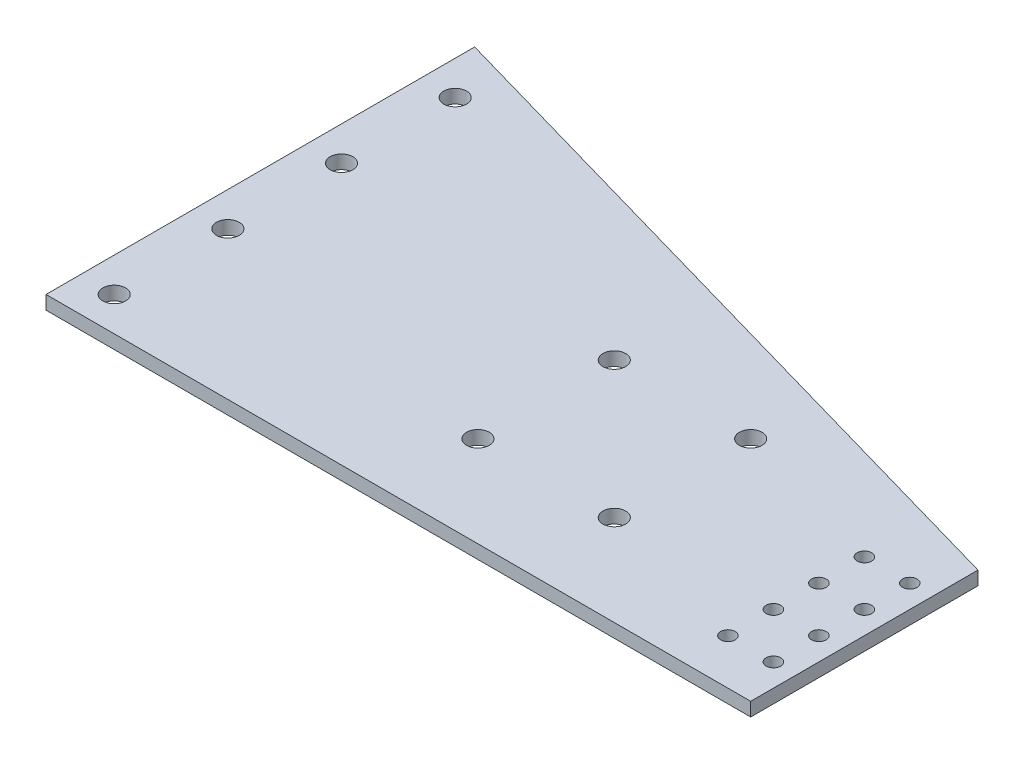
ISO-10303-21;
HEADER;
FILE_DESCRIPTION(('STEP AP214'),'2;1');
FILE_NAME('part.step','',(''),(''),'','','');
FILE_SCHEMA(('AUTOMOTIVE_DESIGN { 1 0 10303 214 1 1 1 1 }'));
ENDSEC;
DATA;
#1=APPLICATION_CONTEXT('core data for automotive mechanical design processes');
#2=APPLICATION_PROTOCOL_DEFINITION('international standard','automotive_design',2000,#1);
#3=PRODUCT_CONTEXT('',#1,'mechanical');
#4=PRODUCT('Part','Part','',(#3));
#5=PRODUCT_RELATED_PRODUCT_CATEGORY('part','',(#4));
#6=PRODUCT_DEFINITION_FORMATION('','',#4);
#7=PRODUCT_DEFINITION_CONTEXT('part definition',#1,'design');
#8=PRODUCT_DEFINITION('design','',#6,#7);
#9=PRODUCT_DEFINITION_SHAPE('','',#8);
#10=(LENGTH_UNIT() NAMED_UNIT(*) SI_UNIT(.MILLI.,.METRE.));
#11=(NAMED_UNIT(*) PLANE_ANGLE_UNIT() SI_UNIT($,.RADIAN.));
#12=(NAMED_UNIT(*) SI_UNIT($,.STERADIAN.) SOLID_ANGLE_UNIT());
#13=UNCERTAINTY_MEASURE_WITH_UNIT(LENGTH_MEASURE(1.E-05),#10,'distance_accuracy_value','');
#14=(GEOMETRIC_REPRESENTATION_CONTEXT(3) GLOBAL_UNCERTAINTY_ASSIGNED_CONTEXT((#13)) GLOBAL_UNIT_ASSIGNED_CONTEXT((#10,
#11,#12)) REPRESENTATION_CONTEXT('',''));
#15=CARTESIAN_POINT('',(0.,0.,0.));
#16=DIRECTION('',(0.,0.,1.));
#17=DIRECTION('',(1.,0.,0.));
#18=AXIS2_PLACEMENT_3D('',#15,#16,#17);
#19=CARTESIAN_POINT('',(0.,0.,0.));
#20=DIRECTION('',(0.,1.,0.));
#21=DIRECTION('',(0.,0.,1.));
#22=AXIS2_PLACEMENT_3D('',#19,#20,#21);
#23=PLANE('',#22);
#24=CARTESIAN_POINT('',(65.,0.,25.));
#25=DIRECTION('',(0.,-1.,0.));
#26=DIRECTION('',(0.,0.,-1.));
#27=AXIS2_PLACEMENT_3D('',#24,#25,#26);
#28=CIRCLE('',#27,1.6);
#29=CARTESIAN_POINT('',(65.,0.,23.4));
#30=VERTEX_POINT('',#29);
#31=EDGE_CURVE('E351',#30,#30,#28,.T.);
#32=ORIENTED_EDGE('',*,*,#31,.F.);
#33=EDGE_LOOP('',(#32));
#34=FACE_BOUND('',#33,.T.);
#35=CARTESIAN_POINT('',(65.,0.,35.));
#36=DIRECTION('',(0.,-1.,0.));
#37=DIRECTION('',(0.,0.,-1.));
#38=AXIS2_PLACEMENT_3D('',#35,#36,#37);
#39=CIRCLE('',#38,1.6);
#40=CARTESIAN_POINT('',(65.,0.,33.4));
#41=VERTEX_POINT('',#40);
#42=EDGE_CURVE('E297',#41,#41,#39,.T.);
#43=ORIENTED_EDGE('',*,*,#42,.F.);
#44=EDGE_LOOP('',(#43));
#45=FACE_BOUND('',#44,.T.);
#46=CARTESIAN_POINT('',(-10.,0.,-5.));
#47=DIRECTION('',(0.,-1.,0.));
#48=DIRECTION('',(0.,0.,-1.));
#49=AXIS2_PLACEMENT_3D('',#46,#47,#48);
#50=CIRCLE('',#49,2.49999999999999);
#51=CARTESIAN_POINT('',(-10.,0.,-7.49999999999999));
#52=VERTEX_POINT('',#51);
#53=EDGE_CURVE('E295',#52,#52,#50,.T.);
#54=ORIENTED_EDGE('',*,*,#53,.F.);
#55=EDGE_LOOP('',(#54));
#56=FACE_BOUND('',#55,.T.);
#57=DIRECTION('',(0.961523947640823,0.,0.274721127897378));
#58=VECTOR('',#57,1.);
#59=CARTESIAN_POINT('',(6.60377358490566,0.,-23.1132075471698));
#60=LINE('',#59,#58);
#61=CARTESIAN_POINT('',(-85.,0.,-49.2857142857143));
#62=VERTEX_POINT('',#61);
#63=CARTESIAN_POINT('',(70.,0.,-5.));
#64=VERTEX_POINT('',#63);
#65=EDGE_CURVE('E105',#62,#64,#60,.T.);
#66=ORIENTED_EDGE('',*,*,#65,.T.);
#67=DIRECTION('',(0.,0.,-1.));
#68=VECTOR('',#67,1.);
#69=CARTESIAN_POINT('',(70.,0.,0.));
#70=LINE('',#69,#68);
#71=CARTESIAN_POINT('',(70.,0.,45.));
#72=VERTEX_POINT('',#71);
#73=EDGE_CURVE('E111',#72,#64,#70,.T.);
#74=ORIENTED_EDGE('',*,*,#73,.F.);
#75=DIRECTION('',(1.,0.,0.));
#76=VECTOR('',#75,1.);
#77=CARTESIAN_POINT('',(0.,0.,45.));
#78=LINE('',#77,#76);
#79=CARTESIAN_POINT('',(-85.,0.,45.));
#80=VERTEX_POINT('',#79);
#81=EDGE_CURVE('E71',#80,#72,#78,.T.);
#82=ORIENTED_EDGE('',*,*,#81,.F.);
#83=DIRECTION('',(0.,0.,1.));
#84=VECTOR('',#83,1.);
#85=CARTESIAN_POINT('',(-85.,0.,0.));
#86=LINE('',#85,#84);
#87=EDGE_CURVE('E97',#62,#80,#86,.T.);
#88=ORIENTED_EDGE('',*,*,#87,.F.);
#89=EDGE_LOOP('',(#66,#74,#82,#88));
#90=FACE_BOUND('',#89,.T.);
#91=CARTESIAN_POINT('',(-77.5,0.,-12.5));
#92=DIRECTION('',(0.,1.,0.));
#93=DIRECTION('',(0.,0.,1.));
#94=AXIS2_PLACEMENT_3D('',#91,#92,#93);
#95=CIRCLE('',#94,2.5);
#96=CARTESIAN_POINT('',(-77.5,0.,-10.));
#97=VERTEX_POINT('',#96);
#98=EDGE_CURVE('E108',#97,#97,#95,.T.);
#99=ORIENTED_EDGE('',*,*,#98,.T.);
#100=EDGE_LOOP('',(#99));
#101=FACE_BOUND('',#100,.T.);
#102=CARTESIAN_POINT('',(-77.5,0.,-37.5));
#103=DIRECTION('',(0.,1.,0.));
#104=DIRECTION('',(0.,0.,1.));
#105=AXIS2_PLACEMENT_3D('',#102,#103,#104);
#106=CIRCLE('',#105,2.5);
#107=CARTESIAN_POINT('',(-77.5,0.,-35.));
#108=VERTEX_POINT('',#107);
#109=EDGE_CURVE('E248',#108,#108,#106,.T.);
#110=ORIENTED_EDGE('',*,*,#109,.T.);
#111=EDGE_LOOP('',(#110));
#112=FACE_BOUND('',#111,.T.);
#113=CARTESIAN_POINT('',(-77.5,0.,12.5));
#114=DIRECTION('',(0.,1.,0.));
#115=DIRECTION('',(0.,0.,1.));
#116=AXIS2_PLACEMENT_3D('',#113,#114,#115);
#117=CIRCLE('',#116,2.5);
#118=CARTESIAN_POINT('',(-77.5,0.,15.));
#119=VERTEX_POINT('',#118);
#120=EDGE_CURVE('E265',#119,#119,#117,.T.);
#121=ORIENTED_EDGE('',*,*,#120,.T.);
#122=EDGE_LOOP('',(#121));
#123=FACE_BOUND('',#122,.T.);
#124=CARTESIAN_POINT('',(-77.5,0.,37.5));
#125=DIRECTION('',(0.,1.,0.));
#126=DIRECTION('',(0.,0.,1.));
#127=AXIS2_PLACEMENT_3D('',#124,#125,#126);
#128=CIRCLE('',#127,2.5);
#129=CARTESIAN_POINT('',(-77.5,0.,40.));
#130=VERTEX_POINT('',#129);
#131=EDGE_CURVE('E269',#130,#130,#128,.T.);
#132=ORIENTED_EDGE('',*,*,#131,.T.);
#133=EDGE_LOOP('',(#132));
#134=FACE_BOUND('',#133,.T.);
#135=CARTESIAN_POINT('',(20.,0.,25.));
#136=DIRECTION('',(0.,-1.,0.));
#137=DIRECTION('',(0.,0.,-1.));
#138=AXIS2_PLACEMENT_3D('',#135,#136,#137);
#139=CIRCLE('',#138,2.49999999999999);
#140=CARTESIAN_POINT('',(20.,0.,22.5));
#141=VERTEX_POINT('',#140);
#142=EDGE_CURVE('E273',#141,#141,#139,.T.);
#143=ORIENTED_EDGE('',*,*,#142,.F.);
#144=EDGE_LOOP('',(#143));
#145=FACE_BOUND('',#144,.T.);
#146=CARTESIAN_POINT('',(20.,0.,-4.99999999999999));
#147=DIRECTION('',(0.,-1.,0.));
#148=DIRECTION('',(0.,0.,-1.));
#149=AXIS2_PLACEMENT_3D('',#146,#147,#148);
#150=CIRCLE('',#149,2.49999999999999);
#151=CARTESIAN_POINT('',(20.,0.,-7.49999999999998));
#152=VERTEX_POINT('',#151);
#153=EDGE_CURVE('E277',#152,#152,#150,.T.);
#154=ORIENTED_EDGE('',*,*,#153,.F.);
#155=EDGE_LOOP('',(#154));
#156=FACE_BOUND('',#155,.T.);
#157=CARTESIAN_POINT('',(-10.,0.,25.));
#158=DIRECTION('',(0.,-1.,0.));
#159=DIRECTION('',(0.,0.,-1.));
#160=AXIS2_PLACEMENT_3D('',#157,#158,#159);
#161=CIRCLE('',#160,2.49999999999999);
#162=CARTESIAN_POINT('',(-10.,0.,22.5));
#163=VERTEX_POINT('',#162);
#164=EDGE_CURVE('E281',#163,#163,#161,.T.);
#165=ORIENTED_EDGE('',*,*,#164,.F.);
#166=EDGE_LOOP('',(#165));
#167=FACE_BOUND('',#166,.T.);
#168=CARTESIAN_POINT('',(65.,0.,15.));
#169=DIRECTION('',(0.,-1.,0.));
#170=DIRECTION('',(0.,0.,-1.));
#171=AXIS2_PLACEMENT_3D('',#168,#169,#170);
#172=CIRCLE('',#171,1.6);
#173=CARTESIAN_POINT('',(65.,0.,13.4));
#174=VERTEX_POINT('',#173);
#175=EDGE_CURVE('E119',#174,#174,#172,.T.);
#176=ORIENTED_EDGE('',*,*,#175,.F.);
#177=EDGE_LOOP('',(#176));
#178=FACE_BOUND('',#177,.T.);
#179=CARTESIAN_POINT('',(65.,0.,5.));
#180=DIRECTION('',(0.,-1.,0.));
#181=DIRECTION('',(0.,0.,-1.));
#182=AXIS2_PLACEMENT_3D('',#179,#180,#181);
#183=CIRCLE('',#182,1.6);
#184=CARTESIAN_POINT('',(65.,0.,3.39999999999999));
#185=VERTEX_POINT('',#184);
#186=EDGE_CURVE('E125',#185,#185,#183,.T.);
#187=ORIENTED_EDGE('',*,*,#186,.F.);
#188=EDGE_LOOP('',(#187));
#189=FACE_BOUND('',#188,.T.);
#190=CARTESIAN_POINT('',(55.,0.,35.));
#191=DIRECTION('',(0.,-1.,0.));
#192=DIRECTION('',(0.,0.,-1.));
#193=AXIS2_PLACEMENT_3D('',#190,#191,#192);
#194=CIRCLE('',#193,1.6);
#195=CARTESIAN_POINT('',(55.,0.,33.4));
#196=VERTEX_POINT('',#195);
#197=EDGE_CURVE('E131',#196,#196,#194,.T.);
#198=ORIENTED_EDGE('',*,*,#197,.F.);
#199=EDGE_LOOP('',(#198));
#200=FACE_BOUND('',#199,.T.);
#201=CARTESIAN_POINT('',(55.,0.,25.));
#202=DIRECTION('',(0.,-1.,0.));
#203=DIRECTION('',(0.,0.,-1.));
#204=AXIS2_PLACEMENT_3D('',#201,#202,#203);
#205=CIRCLE('',#204,1.6);
#206=CARTESIAN_POINT('',(55.,0.,23.4));
#207=VERTEX_POINT('',#206);
#208=EDGE_CURVE('E137',#207,#207,#205,.T.);
#209=ORIENTED_EDGE('',*,*,#208,.F.);
#210=EDGE_LOOP('',(#209));
#211=FACE_BOUND('',#210,.T.);
#212=CARTESIAN_POINT('',(55.,0.,15.));
#213=DIRECTION('',(0.,-1.,0.));
#214=DIRECTION('',(0.,0.,-1.));
#215=AXIS2_PLACEMENT_3D('',#212,#213,#214);
#216=CIRCLE('',#215,1.6);
#217=CARTESIAN_POINT('',(55.,0.,13.4));
#218=VERTEX_POINT('',#217);
#219=EDGE_CURVE('E143',#218,#218,#216,.T.);
#220=ORIENTED_EDGE('',*,*,#219,.F.);
#221=EDGE_LOOP('',(#220));
#222=FACE_BOUND('',#221,.T.);
#223=CARTESIAN_POINT('',(55.,0.,5.));
#224=DIRECTION('',(0.,-1.,0.));
#225=DIRECTION('',(0.,0.,-1.));
#226=AXIS2_PLACEMENT_3D('',#223,#224,#225);
#227=CIRCLE('',#226,1.6);
#228=CARTESIAN_POINT('',(55.,0.,3.39999999999999));
#229=VERTEX_POINT('',#228);
#230=EDGE_CURVE('E11',#229,#229,#227,.T.);
#231=ORIENTED_EDGE('',*,*,#230,.F.);
#232=EDGE_LOOP('',(#231));
#233=FACE_BOUND('',#232,.T.);
#234=ADVANCED_FACE('F37',(#34,#45,#56,#90,#101,#112,#123,#134,#145,#156,#167,#178,#189,#200,
#211,#222,#233),#23,.F.);
#235=CARTESIAN_POINT('',(6.60377358490566,3.,-23.1132075471698));
#236=DIRECTION('',(0.274721127897378,0.,-0.961523947640823));
#237=DIRECTION('',(-0.961523947640823,0.,-0.274721127897378));
#238=AXIS2_PLACEMENT_3D('',#235,#236,#237);
#239=PLANE('',#238);
#240=ORIENTED_EDGE('',*,*,#65,.F.);
#241=DIRECTION('',(0.,-1.,0.));
#242=VECTOR('',#241,1.);
#243=CARTESIAN_POINT('',(-85.,3.,-49.2857142857143));
#244=LINE('',#243,#242);
#245=CARTESIAN_POINT('',(-85.,3.,-49.2857142857143));
#246=VERTEX_POINT('',#245);
#247=EDGE_CURVE('E82',#246,#62,#244,.T.);
#248=ORIENTED_EDGE('',*,*,#247,.F.);
#249=DIRECTION('',(0.961523947640823,0.,0.274721127897378));
#250=VECTOR('',#249,1.);
#251=CARTESIAN_POINT('',(6.60377358490566,3.,-23.1132075471698));
#252=LINE('',#251,#250);
#253=CARTESIAN_POINT('',(70.,3.,-5.));
#254=VERTEX_POINT('',#253);
#255=EDGE_CURVE('E91',#246,#254,#252,.T.);
#256=ORIENTED_EDGE('',*,*,#255,.T.);
#257=DIRECTION('',(0.,-1.,0.));
#258=VECTOR('',#257,1.);
#259=CARTESIAN_POINT('',(70.,3.,-5.));
#260=LINE('',#259,#258);
#261=EDGE_CURVE('E78',#254,#64,#260,.T.);
#262=ORIENTED_EDGE('',*,*,#261,.T.);
#263=EDGE_LOOP('',(#240,#248,#256,#262));
#264=FACE_BOUND('',#263,.T.);
#265=ADVANCED_FACE('F155',(#264),#239,.T.);
#266=CARTESIAN_POINT('',(-85.,3.,0.));
#267=DIRECTION('',(1.,0.,0.));
#268=DIRECTION('',(0.,0.,-1.));
#269=AXIS2_PLACEMENT_3D('',#266,#267,#268);
#270=PLANE('',#269);
#271=ORIENTED_EDGE('',*,*,#87,.T.);
#272=DIRECTION('',(0.,-1.,0.));
#273=VECTOR('',#272,1.);
#274=CARTESIAN_POINT('',(-85.,3.,45.));
#275=LINE('',#274,#273);
#276=CARTESIAN_POINT('',(-85.,3.,45.));
#277=VERTEX_POINT('',#276);
#278=EDGE_CURVE('E94',#277,#80,#275,.T.);
#279=ORIENTED_EDGE('',*,*,#278,.F.);
#280=DIRECTION('',(0.,0.,1.));
#281=VECTOR('',#280,1.);
#282=CARTESIAN_POINT('',(-85.,3.,0.));
#283=LINE('',#282,#281);
#284=EDGE_CURVE('E85',#246,#277,#283,.T.);
#285=ORIENTED_EDGE('',*,*,#284,.F.);
#286=ORIENTED_EDGE('',*,*,#247,.T.);
#287=EDGE_LOOP('',(#271,#279,#285,#286));
#288=FACE_BOUND('',#287,.T.);
#289=ADVANCED_FACE('F95',(#288),#270,.F.);
#290=CARTESIAN_POINT('',(0.,3.,45.));
#291=DIRECTION('',(0.,0.,-1.));
#292=DIRECTION('',(-1.,0.,0.));
#293=AXIS2_PLACEMENT_3D('',#290,#291,#292);
#294=PLANE('',#293);
#295=ORIENTED_EDGE('',*,*,#81,.T.);
#296=DIRECTION('',(0.,-1.,0.));
#297=VECTOR('',#296,1.);
#298=CARTESIAN_POINT('',(70.,3.,45.));
#299=LINE('',#298,#297);
#300=CARTESIAN_POINT('',(70.,3.,45.));
#301=VERTEX_POINT('',#300);
#302=EDGE_CURVE('E98',#301,#72,#299,.T.);
#303=ORIENTED_EDGE('',*,*,#302,.F.);
#304=DIRECTION('',(1.,0.,0.));
#305=VECTOR('',#304,1.);
#306=CARTESIAN_POINT('',(0.,3.,45.));
#307=LINE('',#306,#305);
#308=EDGE_CURVE('E90',#277,#301,#307,.T.);
#309=ORIENTED_EDGE('',*,*,#308,.F.);
#310=ORIENTED_EDGE('',*,*,#278,.T.);
#311=EDGE_LOOP('',(#295,#303,#309,#310));
#312=FACE_BOUND('',#311,.T.);
#313=ADVANCED_FACE('F100',(#312),#294,.F.);
#314=CARTESIAN_POINT('',(70.,3.,0.));
#315=DIRECTION('',(-1.,0.,0.));
#316=DIRECTION('',(0.,0.,1.));
#317=AXIS2_PLACEMENT_3D('',#314,#315,#316);
#318=PLANE('',#317);
#319=ORIENTED_EDGE('',*,*,#73,.T.);
#320=ORIENTED_EDGE('',*,*,#261,.F.);
#321=DIRECTION('',(0.,0.,-1.));
#322=VECTOR('',#321,1.);
#323=CARTESIAN_POINT('',(70.,3.,0.));
#324=LINE('',#323,#322);
#325=EDGE_CURVE('E54',#301,#254,#324,.T.);
#326=ORIENTED_EDGE('',*,*,#325,.F.);
#327=ORIENTED_EDGE('',*,*,#302,.T.);
#328=EDGE_LOOP('',(#319,#320,#326,#327));
#329=FACE_BOUND('',#328,.T.);
#330=ADVANCED_FACE('F167',(#329),#318,.F.);
#331=CARTESIAN_POINT('',(0.,3.,0.));
#332=DIRECTION('',(0.,1.,0.));
#333=DIRECTION('',(0.,0.,1.));
#334=AXIS2_PLACEMENT_3D('',#331,#332,#333);
#335=PLANE('',#334);
#336=CARTESIAN_POINT('',(65.,3.,25.));
#337=DIRECTION('',(0.,-1.,0.));
#338=DIRECTION('',(0.,0.,-1.));
#339=AXIS2_PLACEMENT_3D('',#336,#337,#338);
#340=CIRCLE('',#339,1.6);
#341=CARTESIAN_POINT('',(65.,3.,23.4));
#342=VERTEX_POINT('',#341);
#343=EDGE_CURVE('E211',#342,#342,#340,.T.);
#344=ORIENTED_EDGE('',*,*,#343,.T.);
#345=EDGE_LOOP('',(#344));
#346=FACE_BOUND('',#345,.T.);
#347=CARTESIAN_POINT('',(65.,3.,35.));
#348=DIRECTION('',(0.,-1.,0.));
#349=DIRECTION('',(0.,0.,-1.));
#350=AXIS2_PLACEMENT_3D('',#347,#348,#349);
#351=CIRCLE('',#350,1.6);
#352=CARTESIAN_POINT('',(65.,3.,33.4));
#353=VERTEX_POINT('',#352);
#354=EDGE_CURVE('E215',#353,#353,#351,.T.);
#355=ORIENTED_EDGE('',*,*,#354,.T.);
#356=EDGE_LOOP('',(#355));
#357=FACE_BOUND('',#356,.T.);
#358=CARTESIAN_POINT('',(-10.,3.,25.));
#359=DIRECTION('',(0.,1.,0.));
#360=DIRECTION('',(0.,0.,1.));
#361=AXIS2_PLACEMENT_3D('',#358,#359,#360);
#362=CIRCLE('',#361,2.49999999999999);
#363=CARTESIAN_POINT('',(-10.,3.,27.5));
#364=VERTEX_POINT('',#363);
#365=EDGE_CURVE('E219',#364,#364,#362,.T.);
#366=ORIENTED_EDGE('',*,*,#365,.F.);
#367=EDGE_LOOP('',(#366));
#368=FACE_BOUND('',#367,.T.);
#369=CARTESIAN_POINT('',(-10.,3.,-5.));
#370=DIRECTION('',(0.,1.,0.));
#371=DIRECTION('',(0.,0.,1.));
#372=AXIS2_PLACEMENT_3D('',#369,#370,#371);
#373=CIRCLE('',#372,2.49999999999999);
#374=CARTESIAN_POINT('',(-10.,3.,-2.5));
#375=VERTEX_POINT('',#374);
#376=EDGE_CURVE('E223',#375,#375,#373,.T.);
#377=ORIENTED_EDGE('',*,*,#376,.F.);
#378=EDGE_LOOP('',(#377));
#379=FACE_BOUND('',#378,.T.);
#380=CARTESIAN_POINT('',(20.,3.,-4.99999999999999));
#381=DIRECTION('',(0.,1.,0.));
#382=DIRECTION('',(0.,0.,1.));
#383=AXIS2_PLACEMENT_3D('',#380,#381,#382);
#384=CIRCLE('',#383,2.49999999999999);
#385=CARTESIAN_POINT('',(20.,3.,-2.5));
#386=VERTEX_POINT('',#385);
#387=EDGE_CURVE('E227',#386,#386,#384,.T.);
#388=ORIENTED_EDGE('',*,*,#387,.F.);
#389=EDGE_LOOP('',(#388));
#390=FACE_BOUND('',#389,.T.);
#391=CARTESIAN_POINT('',(20.,3.,25.));
#392=DIRECTION('',(0.,1.,0.));
#393=DIRECTION('',(0.,0.,1.));
#394=AXIS2_PLACEMENT_3D('',#391,#392,#393);
#395=CIRCLE('',#394,2.49999999999999);
#396=CARTESIAN_POINT('',(20.,3.,27.5));
#397=VERTEX_POINT('',#396);
#398=EDGE_CURVE('E231',#397,#397,#395,.T.);
#399=ORIENTED_EDGE('',*,*,#398,.F.);
#400=EDGE_LOOP('',(#399));
#401=FACE_BOUND('',#400,.T.);
#402=CARTESIAN_POINT('',(-77.5,3.,37.5));
#403=DIRECTION('',(0.,1.,0.));
#404=DIRECTION('',(0.,0.,1.));
#405=AXIS2_PLACEMENT_3D('',#402,#403,#404);
#406=CIRCLE('',#405,2.5);
#407=CARTESIAN_POINT('',(-77.5,3.,40.));
#408=VERTEX_POINT('',#407);
#409=EDGE_CURVE('E235',#408,#408,#406,.T.);
#410=ORIENTED_EDGE('',*,*,#409,.F.);
#411=EDGE_LOOP('',(#410));
#412=FACE_BOUND('',#411,.T.);
#413=CARTESIAN_POINT('',(-77.5,3.,12.5));
#414=DIRECTION('',(0.,1.,0.));
#415=DIRECTION('',(0.,0.,1.));
#416=AXIS2_PLACEMENT_3D('',#413,#414,#415);
#417=CIRCLE('',#416,2.5);
#418=CARTESIAN_POINT('',(-77.5,3.,15.));
#419=VERTEX_POINT('',#418);
#420=EDGE_CURVE('E239',#419,#419,#417,.T.);
#421=ORIENTED_EDGE('',*,*,#420,.F.);
#422=EDGE_LOOP('',(#421));
#423=FACE_BOUND('',#422,.T.);
#424=CARTESIAN_POINT('',(-77.5,3.,-37.5));
#425=DIRECTION('',(0.,1.,0.));
#426=DIRECTION('',(0.,0.,1.));
#427=AXIS2_PLACEMENT_3D('',#424,#425,#426);
#428=CIRCLE('',#427,2.5);
#429=CARTESIAN_POINT('',(-77.5,3.,-35.));
#430=VERTEX_POINT('',#429);
#431=EDGE_CURVE('E243',#430,#430,#428,.T.);
#432=ORIENTED_EDGE('',*,*,#431,.F.);
#433=EDGE_LOOP('',(#432));
#434=FACE_BOUND('',#433,.T.);
#435=CARTESIAN_POINT('',(-77.5,3.,-12.5));
#436=DIRECTION('',(0.,1.,0.));
#437=DIRECTION('',(0.,0.,1.));
#438=AXIS2_PLACEMENT_3D('',#435,#436,#437);
#439=CIRCLE('',#438,2.5);
#440=CARTESIAN_POINT('',(-77.5,3.,-10.));
#441=VERTEX_POINT('',#440);
#442=EDGE_CURVE('E246',#441,#441,#439,.T.);
#443=ORIENTED_EDGE('',*,*,#442,.F.);
#444=EDGE_LOOP('',(#443));
#445=FACE_BOUND('',#444,.T.);
#446=ORIENTED_EDGE('',*,*,#255,.F.);
#447=ORIENTED_EDGE('',*,*,#284,.T.);
#448=ORIENTED_EDGE('',*,*,#308,.T.);
#449=ORIENTED_EDGE('',*,*,#325,.T.);
#450=EDGE_LOOP('',(#446,#447,#448,#449));
#451=FACE_BOUND('',#450,.T.);
#452=CARTESIAN_POINT('',(65.,3.,15.));
#453=DIRECTION('',(0.,-1.,0.));
#454=DIRECTION('',(0.,0.,-1.));
#455=AXIS2_PLACEMENT_3D('',#452,#453,#454);
#456=CIRCLE('',#455,1.6);
#457=CARTESIAN_POINT('',(65.,3.,13.4));
#458=VERTEX_POINT('',#457);
#459=EDGE_CURVE('E116',#458,#458,#456,.T.);
#460=ORIENTED_EDGE('',*,*,#459,.T.);
#461=EDGE_LOOP('',(#460));
#462=FACE_BOUND('',#461,.T.);
#463=CARTESIAN_POINT('',(65.,3.,5.));
#464=DIRECTION('',(0.,-1.,0.));
#465=DIRECTION('',(0.,0.,-1.));
#466=AXIS2_PLACEMENT_3D('',#463,#464,#465);
#467=CIRCLE('',#466,1.6);
#468=CARTESIAN_POINT('',(65.,3.,3.39999999999999));
#469=VERTEX_POINT('',#468);
#470=EDGE_CURVE('E122',#469,#469,#467,.T.);
#471=ORIENTED_EDGE('',*,*,#470,.T.);
#472=EDGE_LOOP('',(#471));
#473=FACE_BOUND('',#472,.T.);
#474=CARTESIAN_POINT('',(55.,3.,35.));
#475=DIRECTION('',(0.,-1.,0.));
#476=DIRECTION('',(0.,0.,-1.));
#477=AXIS2_PLACEMENT_3D('',#474,#475,#476);
#478=CIRCLE('',#477,1.6);
#479=CARTESIAN_POINT('',(55.,3.,33.4));
#480=VERTEX_POINT('',#479);
#481=EDGE_CURVE('E128',#480,#480,#478,.T.);
#482=ORIENTED_EDGE('',*,*,#481,.T.);
#483=EDGE_LOOP('',(#482));
#484=FACE_BOUND('',#483,.T.);
#485=CARTESIAN_POINT('',(55.,3.,25.));
#486=DIRECTION('',(0.,-1.,0.));
#487=DIRECTION('',(0.,0.,-1.));
#488=AXIS2_PLACEMENT_3D('',#485,#486,#487);
#489=CIRCLE('',#488,1.6);
#490=CARTESIAN_POINT('',(55.,3.,23.4));
#491=VERTEX_POINT('',#490);
#492=EDGE_CURVE('E134',#491,#491,#489,.T.);
#493=ORIENTED_EDGE('',*,*,#492,.T.);
#494=EDGE_LOOP('',(#493));
#495=FACE_BOUND('',#494,.T.);
#496=CARTESIAN_POINT('',(55.,3.,15.));
#497=DIRECTION('',(0.,-1.,0.));
#498=DIRECTION('',(0.,0.,-1.));
#499=AXIS2_PLACEMENT_3D('',#496,#497,#498);
#500=CIRCLE('',#499,1.6);
#501=CARTESIAN_POINT('',(55.,3.,13.4));
#502=VERTEX_POINT('',#501);
#503=EDGE_CURVE('E140',#502,#502,#500,.T.);
#504=ORIENTED_EDGE('',*,*,#503,.T.);
#505=EDGE_LOOP('',(#504));
#506=FACE_BOUND('',#505,.T.);
#507=CARTESIAN_POINT('',(55.,3.,5.));
#508=DIRECTION('',(0.,-1.,0.));
#509=DIRECTION('',(0.,0.,-1.));
#510=AXIS2_PLACEMENT_3D('',#507,#508,#509);
#511=CIRCLE('',#510,1.6);
#512=CARTESIAN_POINT('',(55.,3.,3.39999999999999));
#513=VERTEX_POINT('',#512);
#514=EDGE_CURVE('E46',#513,#513,#511,.T.);
#515=ORIENTED_EDGE('',*,*,#514,.T.);
#516=EDGE_LOOP('',(#515));
#517=FACE_BOUND('',#516,.T.);
#518=ADVANCED_FACE('F87',(#346,#357,#368,#379,#390,#401,#412,#423,#434,#445,#451,#462,#473,#484,
#495,#506,#517),#335,.T.);
#519=CARTESIAN_POINT('',(-77.5,3.,-12.5));
#520=DIRECTION('',(0.,1.,0.));
#521=DIRECTION('',(0.,0.,1.));
#522=AXIS2_PLACEMENT_3D('',#519,#520,#521);
#523=CYLINDRICAL_SURFACE('',#522,2.5);
#524=ORIENTED_EDGE('',*,*,#98,.F.);
#525=EDGE_LOOP('',(#524));
#526=FACE_BOUND('',#525,.T.);
#527=ORIENTED_EDGE('',*,*,#442,.T.);
#528=EDGE_LOOP('',(#527));
#529=FACE_BOUND('',#528,.T.);
#530=ADVANCED_FACE('F201',(#526,#529),#523,.F.);
#531=CARTESIAN_POINT('',(-77.5,3.,-37.5));
#532=DIRECTION('',(0.,1.,0.));
#533=DIRECTION('',(0.,0.,1.));
#534=AXIS2_PLACEMENT_3D('',#531,#532,#533);
#535=CYLINDRICAL_SURFACE('',#534,2.5);
#536=ORIENTED_EDGE('',*,*,#109,.F.);
#537=EDGE_LOOP('',(#536));
#538=FACE_BOUND('',#537,.T.);
#539=ORIENTED_EDGE('',*,*,#431,.T.);
#540=EDGE_LOOP('',(#539));
#541=FACE_BOUND('',#540,.T.);
#542=ADVANCED_FACE('F206',(#538,#541),#535,.F.);
#543=CARTESIAN_POINT('',(-77.5,3.,12.5));
#544=DIRECTION('',(0.,1.,0.));
#545=DIRECTION('',(0.,0.,1.));
#546=AXIS2_PLACEMENT_3D('',#543,#544,#545);
#547=CYLINDRICAL_SURFACE('',#546,2.5);
#548=ORIENTED_EDGE('',*,*,#120,.F.);
#549=EDGE_LOOP('',(#548));
#550=FACE_BOUND('',#549,.T.);
#551=ORIENTED_EDGE('',*,*,#420,.T.);
#552=EDGE_LOOP('',(#551));
#553=FACE_BOUND('',#552,.T.);
#554=ADVANCED_FACE('F313',(#550,#553),#547,.F.);
#555=CARTESIAN_POINT('',(-77.5,3.,37.5));
#556=DIRECTION('',(0.,1.,0.));
#557=DIRECTION('',(0.,0.,1.));
#558=AXIS2_PLACEMENT_3D('',#555,#556,#557);
#559=CYLINDRICAL_SURFACE('',#558,2.5);
#560=ORIENTED_EDGE('',*,*,#131,.F.);
#561=EDGE_LOOP('',(#560));
#562=FACE_BOUND('',#561,.T.);
#563=ORIENTED_EDGE('',*,*,#409,.T.);
#564=EDGE_LOOP('',(#563));
#565=FACE_BOUND('',#564,.T.);
#566=ADVANCED_FACE('F319',(#562,#565),#559,.F.);
#567=CARTESIAN_POINT('',(20.,0.,25.));
#568=DIRECTION('',(0.,-1.,0.));
#569=DIRECTION('',(0.,0.,-1.));
#570=AXIS2_PLACEMENT_3D('',#567,#568,#569);
#571=CYLINDRICAL_SURFACE('',#570,2.49999999999999);
#572=ORIENTED_EDGE('',*,*,#142,.T.);
#573=EDGE_LOOP('',(#572));
#574=FACE_BOUND('',#573,.T.);
#575=ORIENTED_EDGE('',*,*,#398,.T.);
#576=EDGE_LOOP('',(#575));
#577=FACE_BOUND('',#576,.T.);
#578=ADVANCED_FACE('F325',(#574,#577),#571,.F.);
#579=CARTESIAN_POINT('',(20.,0.,-4.99999999999999));
#580=DIRECTION('',(0.,-1.,0.));
#581=DIRECTION('',(0.,0.,-1.));
#582=AXIS2_PLACEMENT_3D('',#579,#580,#581);
#583=CYLINDRICAL_SURFACE('',#582,2.49999999999999);
#584=ORIENTED_EDGE('',*,*,#153,.T.);
#585=EDGE_LOOP('',(#584));
#586=FACE_BOUND('',#585,.T.);
#587=ORIENTED_EDGE('',*,*,#387,.T.);
#588=EDGE_LOOP('',(#587));
#589=FACE_BOUND('',#588,.T.);
#590=ADVANCED_FACE('F329',(#586,#589),#583,.F.);
#591=CARTESIAN_POINT('',(-10.,0.,-5.));
#592=DIRECTION('',(0.,-1.,0.));
#593=DIRECTION('',(0.,0.,-1.));
#594=AXIS2_PLACEMENT_3D('',#591,#592,#593);
#595=CYLINDRICAL_SURFACE('',#594,2.49999999999999);
#596=ORIENTED_EDGE('',*,*,#53,.T.);
#597=EDGE_LOOP('',(#596));
#598=FACE_BOUND('',#597,.T.);
#599=ORIENTED_EDGE('',*,*,#376,.T.);
#600=EDGE_LOOP('',(#599));
#601=FACE_BOUND('',#600,.T.);
#602=ADVANCED_FACE('F333',(#598,#601),#595,.F.);
#603=CARTESIAN_POINT('',(-10.,0.,25.));
#604=DIRECTION('',(0.,-1.,0.));
#605=DIRECTION('',(0.,0.,-1.));
#606=AXIS2_PLACEMENT_3D('',#603,#604,#605);
#607=CYLINDRICAL_SURFACE('',#606,2.49999999999999);
#608=ORIENTED_EDGE('',*,*,#164,.T.);
#609=EDGE_LOOP('',(#608));
#610=FACE_BOUND('',#609,.T.);
#611=ORIENTED_EDGE('',*,*,#365,.T.);
#612=EDGE_LOOP('',(#611));
#613=FACE_BOUND('',#612,.T.);
#614=ADVANCED_FACE('F337',(#610,#613),#607,.F.);
#615=CARTESIAN_POINT('',(65.,0.,35.));
#616=DIRECTION('',(0.,-1.,0.));
#617=DIRECTION('',(0.,0.,-1.));
#618=AXIS2_PLACEMENT_3D('',#615,#616,#617);
#619=CYLINDRICAL_SURFACE('',#618,1.6);
#620=ORIENTED_EDGE('',*,*,#354,.F.);
#621=EDGE_LOOP('',(#620));
#622=FACE_BOUND('',#621,.T.);
#623=ORIENTED_EDGE('',*,*,#42,.T.);
#624=EDGE_LOOP('',(#623));
#625=FACE_BOUND('',#624,.T.);
#626=ADVANCED_FACE('F341',(#622,#625),#619,.F.);
#627=CARTESIAN_POINT('',(65.,0.,25.));
#628=DIRECTION('',(0.,-1.,0.));
#629=DIRECTION('',(0.,0.,-1.));
#630=AXIS2_PLACEMENT_3D('',#627,#628,#629);
#631=CYLINDRICAL_SURFACE('',#630,1.6);
#632=ORIENTED_EDGE('',*,*,#343,.F.);
#633=EDGE_LOOP('',(#632));
#634=FACE_BOUND('',#633,.T.);
#635=ORIENTED_EDGE('',*,*,#31,.T.);
#636=EDGE_LOOP('',(#635));
#637=FACE_BOUND('',#636,.T.);
#638=ADVANCED_FACE('F179',(#634,#637),#631,.F.);
#639=CARTESIAN_POINT('',(65.,0.,15.));
#640=DIRECTION('',(0.,-1.,0.));
#641=DIRECTION('',(0.,0.,-1.));
#642=AXIS2_PLACEMENT_3D('',#639,#640,#641);
#643=CYLINDRICAL_SURFACE('',#642,1.6);
#644=ORIENTED_EDGE('',*,*,#459,.F.);
#645=EDGE_LOOP('',(#644));
#646=FACE_BOUND('',#645,.T.);
#647=ORIENTED_EDGE('',*,*,#175,.T.);
#648=EDGE_LOOP('',(#647));
#649=FACE_BOUND('',#648,.T.);
#650=ADVANCED_FACE('F175',(#646,#649),#643,.F.);
#651=CARTESIAN_POINT('',(65.,0.,5.));
#652=DIRECTION('',(0.,-1.,0.));
#653=DIRECTION('',(0.,0.,-1.));
#654=AXIS2_PLACEMENT_3D('',#651,#652,#653);
#655=CYLINDRICAL_SURFACE('',#654,1.6);
#656=ORIENTED_EDGE('',*,*,#470,.F.);
#657=EDGE_LOOP('',(#656));
#658=FACE_BOUND('',#657,.T.);
#659=ORIENTED_EDGE('',*,*,#186,.T.);
#660=EDGE_LOOP('',(#659));
#661=FACE_BOUND('',#660,.T.);
#662=ADVANCED_FACE('F178',(#658,#661),#655,.F.);
#663=CARTESIAN_POINT('',(55.,0.,35.));
#664=DIRECTION('',(0.,-1.,0.));
#665=DIRECTION('',(0.,0.,-1.));
#666=AXIS2_PLACEMENT_3D('',#663,#664,#665);
#667=CYLINDRICAL_SURFACE('',#666,1.6);
#668=ORIENTED_EDGE('',*,*,#481,.F.);
#669=EDGE_LOOP('',(#668));
#670=FACE_BOUND('',#669,.T.);
#671=ORIENTED_EDGE('',*,*,#197,.T.);
#672=EDGE_LOOP('',(#671));
#673=FACE_BOUND('',#672,.T.);
#674=ADVANCED_FACE('F183',(#670,#673),#667,.F.);
#675=CARTESIAN_POINT('',(55.,0.,25.));
#676=DIRECTION('',(0.,-1.,0.));
#677=DIRECTION('',(0.,0.,-1.));
#678=AXIS2_PLACEMENT_3D('',#675,#676,#677);
#679=CYLINDRICAL_SURFACE('',#678,1.6);
#680=ORIENTED_EDGE('',*,*,#492,.F.);
#681=EDGE_LOOP('',(#680));
#682=FACE_BOUND('',#681,.T.);
#683=ORIENTED_EDGE('',*,*,#208,.T.);
#684=EDGE_LOOP('',(#683));
#685=FACE_BOUND('',#684,.T.);
#686=ADVANCED_FACE('F187',(#682,#685),#679,.F.);
#687=CARTESIAN_POINT('',(55.,0.,15.));
#688=DIRECTION('',(0.,-1.,0.));
#689=DIRECTION('',(0.,0.,-1.));
#690=AXIS2_PLACEMENT_3D('',#687,#688,#689);
#691=CYLINDRICAL_SURFACE('',#690,1.6);
#692=ORIENTED_EDGE('',*,*,#503,.F.);
#693=EDGE_LOOP('',(#692));
#694=FACE_BOUND('',#693,.T.);
#695=ORIENTED_EDGE('',*,*,#219,.T.);
#696=EDGE_LOOP('',(#695));
#697=FACE_BOUND('',#696,.T.);
#698=ADVANCED_FACE('F151',(#694,#697),#691,.F.);
#699=CARTESIAN_POINT('',(55.,0.,5.));
#700=DIRECTION('',(0.,-1.,0.));
#701=DIRECTION('',(0.,0.,-1.));
#702=AXIS2_PLACEMENT_3D('',#699,#700,#701);
#703=CYLINDRICAL_SURFACE('',#702,1.6);
#704=ORIENTED_EDGE('',*,*,#514,.F.);
#705=EDGE_LOOP('',(#704));
#706=FACE_BOUND('',#705,.T.);
#707=ORIENTED_EDGE('',*,*,#230,.T.);
#708=EDGE_LOOP('',(#707));
#709=FACE_BOUND('',#708,.T.);
#710=ADVANCED_FACE('F39',(#706,#709),#703,.F.);
#711=CLOSED_SHELL('',(#234,#265,#289,#313,#330,#518,#530,#542,#554,#566,#578,#590,#602,#614,
#626,#638,#650,#662,#674,#686,#698,#710));
#712=MANIFOLD_SOLID_BREP('B2',#711);
#713=ADVANCED_BREP_SHAPE_REPRESENTATION('',(#18,#712),#14);
#714=SHAPE_DEFINITION_REPRESENTATION(#9,#713);
ENDSEC;
END-ISO-10303-21;
